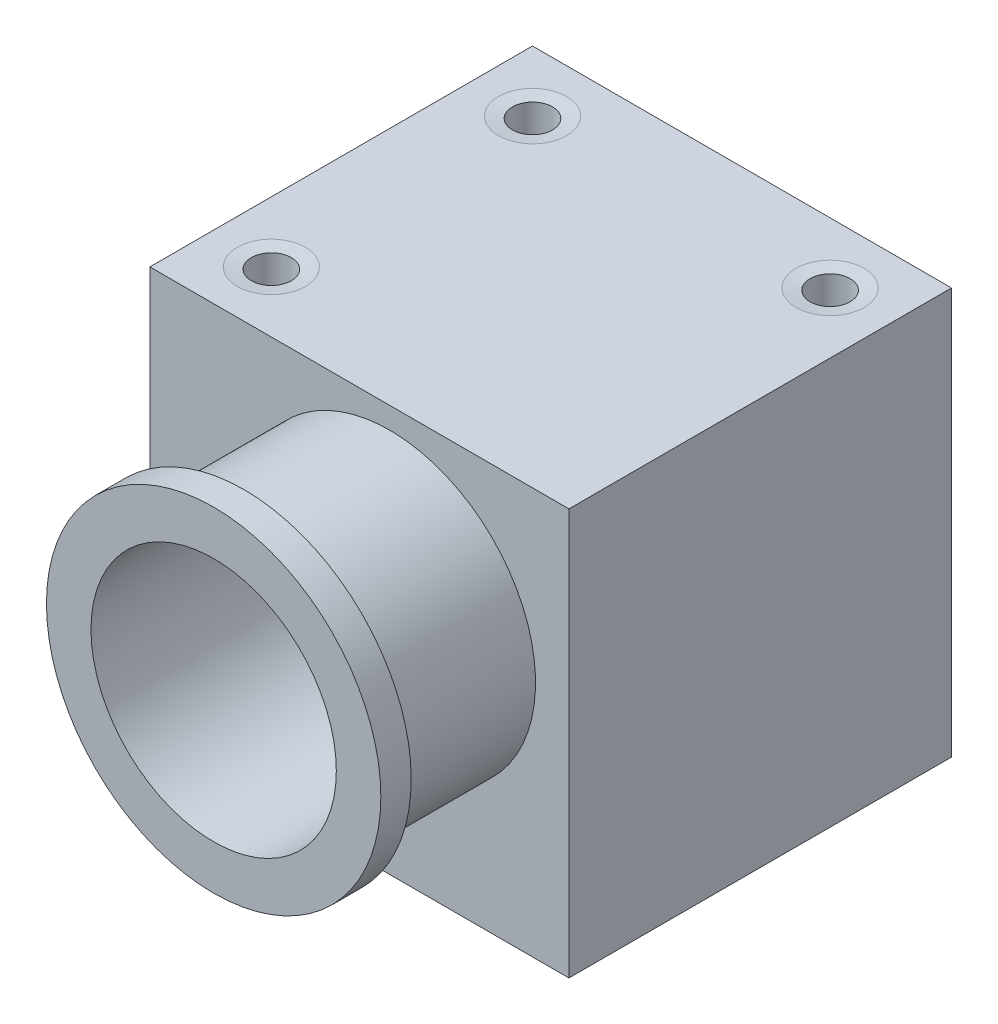
ISO-10303-21;
HEADER;
FILE_DESCRIPTION(('STEP AP214'),'2;1');
FILE_NAME('part.step','',(''),(''),'','','');
FILE_SCHEMA(('AUTOMOTIVE_DESIGN { 1 0 10303 214 1 1 1 1 }'));
ENDSEC;
DATA;
#1=APPLICATION_CONTEXT('core data for automotive mechanical design processes');
#2=APPLICATION_PROTOCOL_DEFINITION('international standard','automotive_design',2000,#1);
#3=PRODUCT_CONTEXT('',#1,'mechanical');
#4=PRODUCT('Part','Part','',(#3));
#5=PRODUCT_RELATED_PRODUCT_CATEGORY('part','',(#4));
#6=PRODUCT_DEFINITION_FORMATION('','',#4);
#7=PRODUCT_DEFINITION_CONTEXT('part definition',#1,'design');
#8=PRODUCT_DEFINITION('design','',#6,#7);
#9=PRODUCT_DEFINITION_SHAPE('','',#8);
#10=(LENGTH_UNIT() NAMED_UNIT(*) SI_UNIT(.MILLI.,.METRE.));
#11=(NAMED_UNIT(*) PLANE_ANGLE_UNIT() SI_UNIT($,.RADIAN.));
#12=(NAMED_UNIT(*) SI_UNIT($,.STERADIAN.) SOLID_ANGLE_UNIT());
#13=UNCERTAINTY_MEASURE_WITH_UNIT(LENGTH_MEASURE(1.E-05),#10,'distance_accuracy_value','');
#14=(GEOMETRIC_REPRESENTATION_CONTEXT(3) GLOBAL_UNCERTAINTY_ASSIGNED_CONTEXT((#13)) GLOBAL_UNIT_ASSIGNED_CONTEXT((#10,
#11,#12)) REPRESENTATION_CONTEXT('',''));
#15=CARTESIAN_POINT('',(0.,0.,0.));
#16=DIRECTION('',(0.,0.,1.));
#17=DIRECTION('',(1.,0.,0.));
#18=AXIS2_PLACEMENT_3D('',#15,#16,#17);
#19=CARTESIAN_POINT('',(-7.493,8.49630000000445,-20.828));
#20=DIRECTION('',(0.,1.,0.));
#21=DIRECTION('',(0.,0.,1.));
#22=AXIS2_PLACEMENT_3D('',#19,#20,#21);
#23=CONICAL_SURFACE('',#22,1.42239999991582,1.43116998660767);
#24=CARTESIAN_POINT('',(-7.493,8.49630000001167,-20.828));
#25=DIRECTION('',(0.,1.,0.));
#26=DIRECTION('',(0.,0.,1.));
#27=AXIS2_PLACEMENT_3D('',#24,#25,#26);
#28=CIRCLE('',#27,1.42239999996718);
#29=CARTESIAN_POINT('',(-7.493,8.49630000001167,-19.4056000000328));
#30=VERTEX_POINT('',#29);
#31=EDGE_CURVE('E22',#30,#30,#28,.T.);
#32=ORIENTED_EDGE('',*,*,#31,.T.);
#33=EDGE_LOOP('',(#32));
#34=FACE_BOUND('',#33,.T.);
#35=CARTESIAN_POINT('',(-7.493,8.41419604436572,-20.828));
#36=DIRECTION('',(0.,1.,0.));
#37=DIRECTION('',(0.,0.,1.));
#38=AXIS2_PLACEMENT_3D('',#35,#36,#37);
#39=CIRCLE('',#38,0.8382);
#40=CARTESIAN_POINT('',(-7.493,8.41419604436572,-19.9898));
#41=VERTEX_POINT('',#40);
#42=EDGE_CURVE('E101',#41,#41,#39,.F.);
#43=ORIENTED_EDGE('',*,*,#42,.T.);
#44=EDGE_LOOP('',(#43));
#45=FACE_BOUND('',#44,.T.);
#46=ADVANCED_FACE('F19',(#34,#45),#23,.F.);
#47=CARTESIAN_POINT('',(4.953254,8.49630000000445,-20.828));
#48=DIRECTION('',(0.,1.,0.));
#49=DIRECTION('',(0.,0.,1.));
#50=AXIS2_PLACEMENT_3D('',#47,#48,#49);
#51=CONICAL_SURFACE('',#50,1.42239999991582,1.43116998660767);
#52=CARTESIAN_POINT('',(4.953254,8.49630000001167,-20.828));
#53=DIRECTION('',(0.,1.,0.));
#54=DIRECTION('',(0.,0.,1.));
#55=AXIS2_PLACEMENT_3D('',#52,#53,#54);
#56=CIRCLE('',#55,1.42239999996718);
#57=CARTESIAN_POINT('',(4.953254,8.49630000001167,-19.4056000000328));
#58=VERTEX_POINT('',#57);
#59=EDGE_CURVE('E139',#58,#58,#56,.T.);
#60=ORIENTED_EDGE('',*,*,#59,.T.);
#61=EDGE_LOOP('',(#60));
#62=FACE_BOUND('',#61,.T.);
#63=CARTESIAN_POINT('',(4.953254,8.41419604436572,-20.828));
#64=DIRECTION('',(0.,1.,0.));
#65=DIRECTION('',(0.,0.,1.));
#66=AXIS2_PLACEMENT_3D('',#63,#64,#65);
#67=CIRCLE('',#66,0.8382);
#68=CARTESIAN_POINT('',(4.953254,8.41419604436572,-19.9898));
#69=VERTEX_POINT('',#68);
#70=EDGE_CURVE('E98',#69,#69,#67,.F.);
#71=ORIENTED_EDGE('',*,*,#70,.T.);
#72=EDGE_LOOP('',(#71));
#73=FACE_BOUND('',#72,.T.);
#74=ADVANCED_FACE('F345',(#62,#73),#51,.F.);
#75=CARTESIAN_POINT('',(-7.493,8.49629999997603,-9.906));
#76=DIRECTION('',(0.,1.,0.));
#77=DIRECTION('',(0.,0.,1.));
#78=AXIS2_PLACEMENT_3D('',#75,#76,#77);
#79=CONICAL_SURFACE('',#78,1.42239999990948,1.43116998664493);
#80=CARTESIAN_POINT('',(-7.493,8.49629999998414,-9.906));
#81=DIRECTION('',(0.,1.,0.));
#82=DIRECTION('',(0.,0.,1.));
#83=AXIS2_PLACEMENT_3D('',#80,#81,#82);
#84=CIRCLE('',#83,1.42239999996718);
#85=CARTESIAN_POINT('',(-7.493,8.49629999998414,-8.48360000003282));
#86=VERTEX_POINT('',#85);
#87=EDGE_CURVE('E93',#86,#86,#84,.T.);
#88=ORIENTED_EDGE('',*,*,#87,.T.);
#89=EDGE_LOOP('',(#88));
#90=FACE_BOUND('',#89,.T.);
#91=CARTESIAN_POINT('',(-7.493,8.41419604436572,-9.906));
#92=DIRECTION('',(0.,1.,0.));
#93=DIRECTION('',(0.,0.,1.));
#94=AXIS2_PLACEMENT_3D('',#91,#92,#93);
#95=CIRCLE('',#94,0.8382);
#96=CARTESIAN_POINT('',(-7.493,8.41419604436572,-9.0678));
#97=VERTEX_POINT('',#96);
#98=EDGE_CURVE('E95',#97,#97,#95,.F.);
#99=ORIENTED_EDGE('',*,*,#98,.T.);
#100=EDGE_LOOP('',(#99));
#101=FACE_BOUND('',#100,.T.);
#102=ADVANCED_FACE('F336',(#90,#101),#79,.F.);
#103=CARTESIAN_POINT('',(-7.493,-11.8237,-20.828));
#104=DIRECTION('',(0.,1.,0.));
#105=DIRECTION('',(0.,0.,1.));
#106=AXIS2_PLACEMENT_3D('',#103,#104,#105);
#107=CYLINDRICAL_SURFACE('',#106,0.8382);
#108=ORIENTED_EDGE('',*,*,#42,.F.);
#109=EDGE_LOOP('',(#108));
#110=FACE_BOUND('',#109,.T.);
#111=CARTESIAN_POINT('',(-7.493,-8.4963,-20.828));
#112=DIRECTION('',(0.,1.,0.));
#113=DIRECTION('',(0.,0.,1.));
#114=AXIS2_PLACEMENT_3D('',#111,#112,#113);
#115=CIRCLE('',#114,0.8382);
#116=CARTESIAN_POINT('',(-7.493,-8.4963,-19.9898));
#117=VERTEX_POINT('',#116);
#118=EDGE_CURVE('E90',#117,#117,#115,.T.);
#119=ORIENTED_EDGE('',*,*,#118,.F.);
#120=EDGE_LOOP('',(#119));
#121=FACE_BOUND('',#120,.T.);
#122=ADVANCED_FACE('F327',(#110,#121),#107,.F.);
#123=CARTESIAN_POINT('',(4.953254,-11.8237,-20.828));
#124=DIRECTION('',(0.,1.,0.));
#125=DIRECTION('',(0.,0.,1.));
#126=AXIS2_PLACEMENT_3D('',#123,#124,#125);
#127=CYLINDRICAL_SURFACE('',#126,0.8382);
#128=ORIENTED_EDGE('',*,*,#70,.F.);
#129=EDGE_LOOP('',(#128));
#130=FACE_BOUND('',#129,.T.);
#131=CARTESIAN_POINT('',(4.953254,-8.4963,-20.828));
#132=DIRECTION('',(0.,1.,0.));
#133=DIRECTION('',(0.,0.,1.));
#134=AXIS2_PLACEMENT_3D('',#131,#132,#133);
#135=CIRCLE('',#134,0.8382);
#136=CARTESIAN_POINT('',(4.953254,-8.4963,-19.9898));
#137=VERTEX_POINT('',#136);
#138=EDGE_CURVE('E133',#137,#137,#135,.T.);
#139=ORIENTED_EDGE('',*,*,#138,.F.);
#140=EDGE_LOOP('',(#139));
#141=FACE_BOUND('',#140,.T.);
#142=ADVANCED_FACE('F318',(#130,#141),#127,.F.);
#143=CARTESIAN_POINT('',(-7.493,-11.8237,-9.906));
#144=DIRECTION('',(0.,1.,0.));
#145=DIRECTION('',(0.,0.,1.));
#146=AXIS2_PLACEMENT_3D('',#143,#144,#145);
#147=CYLINDRICAL_SURFACE('',#146,0.8382);
#148=ORIENTED_EDGE('',*,*,#98,.F.);
#149=EDGE_LOOP('',(#148));
#150=FACE_BOUND('',#149,.T.);
#151=CARTESIAN_POINT('',(-7.493,-8.4963,-9.906));
#152=DIRECTION('',(0.,1.,0.));
#153=DIRECTION('',(0.,0.,1.));
#154=AXIS2_PLACEMENT_3D('',#151,#152,#153);
#155=CIRCLE('',#154,0.8382);
#156=CARTESIAN_POINT('',(-7.493,-8.4963,-9.0678));
#157=VERTEX_POINT('',#156);
#158=EDGE_CURVE('E73',#157,#157,#155,.T.);
#159=ORIENTED_EDGE('',*,*,#158,.F.);
#160=EDGE_LOOP('',(#159));
#161=FACE_BOUND('',#160,.T.);
#162=ADVANCED_FACE('F310',(#150,#161),#147,.F.);
#163=CARTESIAN_POINT('',(-10.033,0.,0.));
#164=DIRECTION('',(-1.,0.,0.));
#165=DIRECTION('',(0.,0.,1.));
#166=AXIS2_PLACEMENT_3D('',#163,#164,#165);
#167=PLANE('',#166);
#168=DIRECTION('',(0.,0.,-1.));
#169=VECTOR('',#168,1.);
#170=CARTESIAN_POINT('',(-10.033,8.4963,-24.1554));
#171=LINE('',#170,#169);
#172=CARTESIAN_POINT('',(-10.033,8.4963,-7.366));
#173=VERTEX_POINT('',#172);
#174=CARTESIAN_POINT('',(-10.033,8.4963,-23.368));
#175=VERTEX_POINT('',#174);
#176=EDGE_CURVE('E58',#173,#175,#171,.T.);
#177=ORIENTED_EDGE('',*,*,#176,.T.);
#178=DIRECTION('',(0.,1.,0.));
#179=VECTOR('',#178,1.);
#180=CARTESIAN_POINT('',(-10.033,0.,-23.368));
#181=LINE('',#180,#179);
#182=CARTESIAN_POINT('',(-10.033,-8.4963,-23.368));
#183=VERTEX_POINT('',#182);
#184=EDGE_CURVE('E78',#183,#175,#181,.T.);
#185=ORIENTED_EDGE('',*,*,#184,.F.);
#186=DIRECTION('',(0.,0.,-1.));
#187=VECTOR('',#186,1.);
#188=CARTESIAN_POINT('',(-10.033,-8.4963,-24.1554));
#189=LINE('',#188,#187);
#190=CARTESIAN_POINT('',(-10.033,-8.4963,-7.366));
#191=VERTEX_POINT('',#190);
#192=EDGE_CURVE('E76',#191,#183,#189,.T.);
#193=ORIENTED_EDGE('',*,*,#192,.F.);
#194=DIRECTION('',(0.,1.,0.));
#195=VECTOR('',#194,1.);
#196=CARTESIAN_POINT('',(-10.033,0.,-7.366));
#197=LINE('',#196,#195);
#198=EDGE_CURVE('E64',#173,#191,#197,.F.);
#199=ORIENTED_EDGE('',*,*,#198,.F.);
#200=EDGE_LOOP('',(#177,#185,#193,#199));
#201=FACE_BOUND('',#200,.T.);
#202=ADVANCED_FACE('F77',(#201),#167,.T.);
#203=CARTESIAN_POINT('',(-7.493,8.4963,-24.1554));
#204=DIRECTION('',(0.,-1.,0.));
#205=DIRECTION('',(0.,0.,-1.));
#206=AXIS2_PLACEMENT_3D('',#203,#204,#205);
#207=PLANE('',#206);
#208=ORIENTED_EDGE('',*,*,#87,.F.);
#209=EDGE_LOOP('',(#208));
#210=FACE_BOUND('',#209,.T.);
#211=ORIENTED_EDGE('',*,*,#59,.F.);
#212=EDGE_LOOP('',(#211));
#213=FACE_BOUND('',#212,.T.);
#214=ORIENTED_EDGE('',*,*,#31,.F.);
#215=EDGE_LOOP('',(#214));
#216=FACE_BOUND('',#215,.T.);
#217=DIRECTION('',(0.,0.,-1.));
#218=VECTOR('',#217,1.);
#219=CARTESIAN_POINT('',(7.493254,8.4963,0.));
#220=LINE('',#219,#218);
#221=CARTESIAN_POINT('',(7.493254,8.4963,-23.368));
#222=VERTEX_POINT('',#221);
#223=CARTESIAN_POINT('',(7.493254,8.4963,-7.366));
#224=VERTEX_POINT('',#223);
#225=EDGE_CURVE('E82',#222,#224,#220,.F.);
#226=ORIENTED_EDGE('',*,*,#225,.F.);
#227=DIRECTION('',(-1.,0.,0.));
#228=VECTOR('',#227,1.);
#229=CARTESIAN_POINT('',(0.,8.4963,-23.368));
#230=LINE('',#229,#228);
#231=EDGE_CURVE('E154',#175,#222,#230,.F.);
#232=ORIENTED_EDGE('',*,*,#231,.F.);
#233=ORIENTED_EDGE('',*,*,#176,.F.);
#234=DIRECTION('',(1.,0.,0.));
#235=VECTOR('',#234,1.);
#236=CARTESIAN_POINT('',(0.,8.4963,-7.366));
#237=LINE('',#236,#235);
#238=EDGE_CURVE('E71',#224,#173,#237,.F.);
#239=ORIENTED_EDGE('',*,*,#238,.F.);
#240=EDGE_LOOP('',(#226,#232,#233,#239));
#241=FACE_BOUND('',#240,.T.);
#242=ADVANCED_FACE('F148',(#210,#213,#216,#241),#207,.F.);
#243=CARTESIAN_POINT('',(7.493254,0.,0.));
#244=DIRECTION('',(1.,0.,0.));
#245=DIRECTION('',(0.,0.,-1.));
#246=AXIS2_PLACEMENT_3D('',#243,#244,#245);
#247=PLANE('',#246);
#248=ORIENTED_EDGE('',*,*,#225,.T.);
#249=DIRECTION('',(0.,1.,0.));
#250=VECTOR('',#249,1.);
#251=CARTESIAN_POINT('',(7.493254,0.,-7.366));
#252=LINE('',#251,#250);
#253=CARTESIAN_POINT('',(7.493254,-8.4963,-7.366));
#254=VERTEX_POINT('',#253);
#255=EDGE_CURVE('E85',#254,#224,#252,.T.);
#256=ORIENTED_EDGE('',*,*,#255,.F.);
#257=DIRECTION('',(0.,0.,-1.));
#258=VECTOR('',#257,1.);
#259=CARTESIAN_POINT('',(7.493254,-8.4963,-24.1554));
#260=LINE('',#259,#258);
#261=CARTESIAN_POINT('',(7.493254,-8.4963,-23.368));
#262=VERTEX_POINT('',#261);
#263=EDGE_CURVE('E81',#262,#254,#260,.F.);
#264=ORIENTED_EDGE('',*,*,#263,.F.);
#265=DIRECTION('',(0.,1.,0.));
#266=VECTOR('',#265,1.);
#267=CARTESIAN_POINT('',(7.493254,0.,-23.368));
#268=LINE('',#267,#266);
#269=EDGE_CURVE('E37',#222,#262,#268,.F.);
#270=ORIENTED_EDGE('',*,*,#269,.F.);
#271=EDGE_LOOP('',(#248,#256,#264,#270));
#272=FACE_BOUND('',#271,.T.);
#273=ADVANCED_FACE('F150',(#272),#247,.T.);
#274=CARTESIAN_POINT('',(-7.493,-8.4963,-24.1554));
#275=DIRECTION('',(0.,-1.,0.));
#276=DIRECTION('',(0.,0.,-1.));
#277=AXIS2_PLACEMENT_3D('',#274,#275,#276);
#278=PLANE('',#277);
#279=ORIENTED_EDGE('',*,*,#158,.T.);
#280=EDGE_LOOP('',(#279));
#281=FACE_BOUND('',#280,.T.);
#282=ORIENTED_EDGE('',*,*,#138,.T.);
#283=EDGE_LOOP('',(#282));
#284=FACE_BOUND('',#283,.T.);
#285=ORIENTED_EDGE('',*,*,#118,.T.);
#286=EDGE_LOOP('',(#285));
#287=FACE_BOUND('',#286,.T.);
#288=ORIENTED_EDGE('',*,*,#263,.T.);
#289=DIRECTION('',(1.,0.,0.));
#290=VECTOR('',#289,1.);
#291=CARTESIAN_POINT('',(0.,-8.4963,-7.366));
#292=LINE('',#291,#290);
#293=EDGE_CURVE('E69',#191,#254,#292,.T.);
#294=ORIENTED_EDGE('',*,*,#293,.F.);
#295=ORIENTED_EDGE('',*,*,#192,.T.);
#296=DIRECTION('',(-1.,0.,0.));
#297=VECTOR('',#296,1.);
#298=CARTESIAN_POINT('',(0.,-8.4963,-23.368));
#299=LINE('',#298,#297);
#300=EDGE_CURVE('E130',#262,#183,#299,.T.);
#301=ORIENTED_EDGE('',*,*,#300,.F.);
#302=EDGE_LOOP('',(#288,#294,#295,#301));
#303=FACE_BOUND('',#302,.T.);
#304=ADVANCED_FACE('F84',(#281,#284,#287,#303),#278,.T.);
#305=CARTESIAN_POINT('',(0.,0.,-7.366));
#306=DIRECTION('',(0.,0.,1.));
#307=DIRECTION('',(1.,0.,0.));
#308=AXIS2_PLACEMENT_3D('',#305,#306,#307);
#309=PLANE('',#308);
#310=CARTESIAN_POINT('',(0.,1.50369999999988,-7.366));
#311=DIRECTION('',(0.,0.,-1.));
#312=DIRECTION('',(-1.,0.,0.));
#313=AXIS2_PLACEMENT_3D('',#310,#311,#312);
#314=CIRCLE('',#313,6.096);
#315=CARTESIAN_POINT('',(-6.096,1.50369999999988,-7.366));
#316=VERTEX_POINT('',#315);
#317=EDGE_CURVE('E127',#316,#316,#314,.F.);
#318=ORIENTED_EDGE('',*,*,#317,.F.);
#319=EDGE_LOOP('',(#318));
#320=FACE_BOUND('',#319,.T.);
#321=ORIENTED_EDGE('',*,*,#255,.T.);
#322=ORIENTED_EDGE('',*,*,#238,.T.);
#323=ORIENTED_EDGE('',*,*,#198,.T.);
#324=ORIENTED_EDGE('',*,*,#293,.T.);
#325=EDGE_LOOP('',(#321,#322,#323,#324));
#326=FACE_BOUND('',#325,.T.);
#327=ADVANCED_FACE('F67',(#320,#326),#309,.T.);
#328=CARTESIAN_POINT('',(0.,0.,-23.368));
#329=DIRECTION('',(0.,0.,-1.));
#330=DIRECTION('',(-1.,0.,0.));
#331=AXIS2_PLACEMENT_3D('',#328,#329,#330);
#332=PLANE('',#331);
#333=CARTESIAN_POINT('',(0.,1.50369999999988,-23.368));
#334=DIRECTION('',(0.,0.,1.));
#335=DIRECTION('',(1.,0.,0.));
#336=AXIS2_PLACEMENT_3D('',#333,#334,#335);
#337=CIRCLE('',#336,1.4224);
#338=CARTESIAN_POINT('',(1.4224,1.50369999999988,-23.368));
#339=VERTEX_POINT('',#338);
#340=EDGE_CURVE('E124',#339,#339,#337,.T.);
#341=ORIENTED_EDGE('',*,*,#340,.T.);
#342=EDGE_LOOP('',(#341));
#343=FACE_BOUND('',#342,.T.);
#344=ORIENTED_EDGE('',*,*,#269,.T.);
#345=ORIENTED_EDGE('',*,*,#300,.T.);
#346=ORIENTED_EDGE('',*,*,#184,.T.);
#347=ORIENTED_EDGE('',*,*,#231,.T.);
#348=EDGE_LOOP('',(#344,#345,#346,#347));
#349=FACE_BOUND('',#348,.T.);
#350=ADVANCED_FACE('F160',(#343,#349),#332,.T.);
#351=CARTESIAN_POINT('',(0.,1.50369999999988,-1.27));
#352=DIRECTION('',(0.,0.,-1.));
#353=DIRECTION('',(-1.,0.,0.));
#354=AXIS2_PLACEMENT_3D('',#351,#352,#353);
#355=CYLINDRICAL_SURFACE('',#354,6.096);
#356=ORIENTED_EDGE('',*,*,#317,.T.);
#357=EDGE_LOOP('',(#356));
#358=FACE_BOUND('',#357,.T.);
#359=CARTESIAN_POINT('',(0.,1.50369999999988,-1.27));
#360=DIRECTION('',(0.,0.,-1.));
#361=DIRECTION('',(-1.,0.,0.));
#362=AXIS2_PLACEMENT_3D('',#359,#360,#361);
#363=CIRCLE('',#362,6.096);
#364=CARTESIAN_POINT('',(-6.096,1.50369999999988,-1.27));
#365=VERTEX_POINT('',#364);
#366=EDGE_CURVE('E121',#365,#365,#363,.T.);
#367=ORIENTED_EDGE('',*,*,#366,.T.);
#368=EDGE_LOOP('',(#367));
#369=FACE_BOUND('',#368,.T.);
#370=ADVANCED_FACE('F162',(#358,#369),#355,.T.);
#371=CARTESIAN_POINT('',(0.,1.50369999999988,-24.1554));
#372=DIRECTION('',(0.,0.,1.));
#373=DIRECTION('',(1.,0.,0.));
#374=AXIS2_PLACEMENT_3D('',#371,#372,#373);
#375=CYLINDRICAL_SURFACE('',#374,1.4224);
#376=CARTESIAN_POINT('',(0.,1.50369999999988,-19.558));
#377=DIRECTION('',(0.,0.,1.));
#378=DIRECTION('',(1.,0.,0.));
#379=AXIS2_PLACEMENT_3D('',#376,#377,#378);
#380=CIRCLE('',#379,1.4224);
#381=CARTESIAN_POINT('',(1.4224,1.50369999999988,-19.558));
#382=VERTEX_POINT('',#381);
#383=EDGE_CURVE('E118',#382,#382,#380,.F.);
#384=ORIENTED_EDGE('',*,*,#383,.F.);
#385=EDGE_LOOP('',(#384));
#386=FACE_BOUND('',#385,.T.);
#387=ORIENTED_EDGE('',*,*,#340,.F.);
#388=EDGE_LOOP('',(#387));
#389=FACE_BOUND('',#388,.T.);
#390=ADVANCED_FACE('F170',(#386,#389),#375,.F.);
#391=CARTESIAN_POINT('',(0.,1.50369999999988,-1.27));
#392=DIRECTION('',(0.,0.,1.));
#393=DIRECTION('',(1.,0.,0.));
#394=AXIS2_PLACEMENT_3D('',#391,#392,#393);
#395=PLANE('',#394);
#396=ORIENTED_EDGE('',*,*,#366,.F.);
#397=EDGE_LOOP('',(#396));
#398=FACE_BOUND('',#397,.T.);
#399=CARTESIAN_POINT('',(0.,1.50369999999988,-1.27));
#400=DIRECTION('',(0.,0.,-1.));
#401=DIRECTION('',(-1.,0.,0.));
#402=AXIS2_PLACEMENT_3D('',#399,#400,#401);
#403=CIRCLE('',#402,6.99259999999936);
#404=CARTESIAN_POINT('',(-6.99259999999936,1.50369999999988,-1.27));
#405=VERTEX_POINT('',#404);
#406=EDGE_CURVE('E115',#405,#405,#403,.F.);
#407=ORIENTED_EDGE('',*,*,#406,.F.);
#408=EDGE_LOOP('',(#407));
#409=FACE_BOUND('',#408,.T.);
#410=ADVANCED_FACE('F203',(#398,#409),#395,.F.);
#411=CARTESIAN_POINT('',(0.,1.50369999999988,-19.558));
#412=DIRECTION('',(0.,0.,1.));
#413=DIRECTION('',(1.,0.,0.));
#414=AXIS2_PLACEMENT_3D('',#411,#412,#413);
#415=PLANE('',#414);
#416=ORIENTED_EDGE('',*,*,#383,.T.);
#417=EDGE_LOOP('',(#416));
#418=FACE_BOUND('',#417,.T.);
#419=CARTESIAN_POINT('',(0.,1.50369999999988,-19.558));
#420=DIRECTION('',(0.,0.,1.));
#421=DIRECTION('',(1.,0.,0.));
#422=AXIS2_PLACEMENT_3D('',#419,#420,#421);
#423=CIRCLE('',#422,3.2639);
#424=CARTESIAN_POINT('',(3.2639,1.50369999999988,-19.558));
#425=VERTEX_POINT('',#424);
#426=EDGE_CURVE('E112',#425,#425,#423,.T.);
#427=ORIENTED_EDGE('',*,*,#426,.T.);
#428=EDGE_LOOP('',(#427));
#429=FACE_BOUND('',#428,.T.);
#430=ADVANCED_FACE('F199',(#418,#429),#415,.T.);
#431=CARTESIAN_POINT('',(0.,1.50369999999988,0.));
#432=DIRECTION('',(0.,0.,-1.));
#433=DIRECTION('',(-1.,0.,0.));
#434=AXIS2_PLACEMENT_3D('',#431,#432,#433);
#435=CYLINDRICAL_SURFACE('',#434,6.99259999999936);
#436=ORIENTED_EDGE('',*,*,#406,.T.);
#437=EDGE_LOOP('',(#436));
#438=FACE_BOUND('',#437,.T.);
#439=CARTESIAN_POINT('',(0.,1.50369999999988,0.));
#440=DIRECTION('',(0.,0.,-1.));
#441=DIRECTION('',(-1.,0.,0.));
#442=AXIS2_PLACEMENT_3D('',#439,#440,#441);
#443=CIRCLE('',#442,6.99259999999936);
#444=CARTESIAN_POINT('',(-6.99259999999936,1.50369999999988,0.));
#445=VERTEX_POINT('',#444);
#446=EDGE_CURVE('E109',#445,#445,#443,.F.);
#447=ORIENTED_EDGE('',*,*,#446,.F.);
#448=EDGE_LOOP('',(#447));
#449=FACE_BOUND('',#448,.T.);
#450=ADVANCED_FACE('F195',(#438,#449),#435,.T.);
#451=CARTESIAN_POINT('',(0.,1.50369999999988,-19.558));
#452=DIRECTION('',(0.,0.,1.));
#453=DIRECTION('',(1.,0.,0.));
#454=AXIS2_PLACEMENT_3D('',#451,#452,#453);
#455=CYLINDRICAL_SURFACE('',#454,3.2639);
#456=CARTESIAN_POINT('',(0.,1.50369999999988,-18.288));
#457=DIRECTION('',(0.,0.,1.));
#458=DIRECTION('',(1.,0.,0.));
#459=AXIS2_PLACEMENT_3D('',#456,#457,#458);
#460=CIRCLE('',#459,3.2639);
#461=CARTESIAN_POINT('',(3.2639,1.50369999999988,-18.288));
#462=VERTEX_POINT('',#461);
#463=EDGE_CURVE('E106',#462,#462,#460,.F.);
#464=ORIENTED_EDGE('',*,*,#463,.F.);
#465=EDGE_LOOP('',(#464));
#466=FACE_BOUND('',#465,.T.);
#467=ORIENTED_EDGE('',*,*,#426,.F.);
#468=EDGE_LOOP('',(#467));
#469=FACE_BOUND('',#468,.T.);
#470=ADVANCED_FACE('F191',(#466,#469),#455,.F.);
#471=CARTESIAN_POINT('',(0.,1.50369999999988,0.));
#472=DIRECTION('',(0.,0.,1.));
#473=DIRECTION('',(1.,0.,0.));
#474=AXIS2_PLACEMENT_3D('',#471,#472,#473);
#475=PLANE('',#474);
#476=CARTESIAN_POINT('',(0.,1.50369999999988,0.));
#477=DIRECTION('',(0.,0.,1.));
#478=DIRECTION('',(1.,0.,0.));
#479=AXIS2_PLACEMENT_3D('',#476,#477,#478);
#480=CIRCLE('',#479,5.1308);
#481=CARTESIAN_POINT('',(5.1308,1.50369999999988,0.));
#482=VERTEX_POINT('',#481);
#483=EDGE_CURVE('E28',#482,#482,#480,.F.);
#484=ORIENTED_EDGE('',*,*,#483,.T.);
#485=EDGE_LOOP('',(#484));
#486=FACE_BOUND('',#485,.T.);
#487=ORIENTED_EDGE('',*,*,#446,.T.);
#488=EDGE_LOOP('',(#487));
#489=FACE_BOUND('',#488,.T.);
#490=ADVANCED_FACE('F183',(#486,#489),#475,.T.);
#491=CARTESIAN_POINT('',(0.,1.50369999999988,-18.288));
#492=DIRECTION('',(0.,0.,1.));
#493=DIRECTION('',(1.,0.,0.));
#494=AXIS2_PLACEMENT_3D('',#491,#492,#493);
#495=PLANE('',#494);
#496=ORIENTED_EDGE('',*,*,#463,.T.);
#497=EDGE_LOOP('',(#496));
#498=FACE_BOUND('',#497,.T.);
#499=CARTESIAN_POINT('',(0.,1.50369999999988,-18.288));
#500=DIRECTION('',(0.,0.,1.));
#501=DIRECTION('',(1.,0.,0.));
#502=AXIS2_PLACEMENT_3D('',#499,#500,#501);
#503=CIRCLE('',#502,5.1308);
#504=CARTESIAN_POINT('',(5.1308,1.50369999999988,-18.288));
#505=VERTEX_POINT('',#504);
#506=EDGE_CURVE('E11',#505,#505,#503,.T.);
#507=ORIENTED_EDGE('',*,*,#506,.T.);
#508=EDGE_LOOP('',(#507));
#509=FACE_BOUND('',#508,.T.);
#510=ADVANCED_FACE('F177',(#498,#509),#495,.T.);
#511=CARTESIAN_POINT('',(0.,1.50369999999988,-18.288));
#512=DIRECTION('',(0.,0.,1.));
#513=DIRECTION('',(1.,0.,0.));
#514=AXIS2_PLACEMENT_3D('',#511,#512,#513);
#515=CYLINDRICAL_SURFACE('',#514,5.1308);
#516=ORIENTED_EDGE('',*,*,#483,.F.);
#517=EDGE_LOOP('',(#516));
#518=FACE_BOUND('',#517,.T.);
#519=ORIENTED_EDGE('',*,*,#506,.F.);
#520=EDGE_LOOP('',(#519));
#521=FACE_BOUND('',#520,.T.);
#522=ADVANCED_FACE('F175',(#518,#521),#515,.F.);
#523=CLOSED_SHELL('',(#46,#74,#102,#122,#142,#162,#202,#242,#273,#304,#327,#350,#370,#390,#410,
#430,#450,#470,#490,#510,#522));
#524=MANIFOLD_SOLID_BREP('B1',#523);
#525=ADVANCED_BREP_SHAPE_REPRESENTATION('',(#18,#524),#14);
#526=SHAPE_DEFINITION_REPRESENTATION(#9,#525);
ENDSEC;
END-ISO-10303-21;
